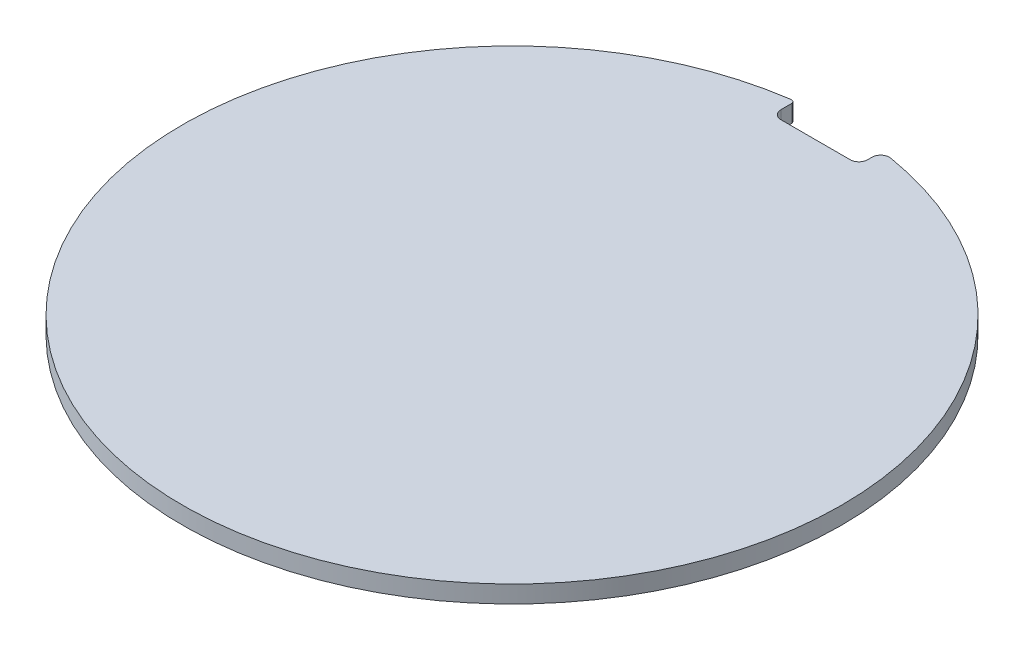
ISO-10303-21;
HEADER;
FILE_DESCRIPTION(('STEP AP214'),'2;1');
FILE_NAME('part.step','',(''),(''),'','','');
FILE_SCHEMA(('AUTOMOTIVE_DESIGN { 1 0 10303 214 1 1 1 1 }'));
ENDSEC;
DATA;
#1=APPLICATION_CONTEXT('core data for automotive mechanical design processes');
#2=APPLICATION_PROTOCOL_DEFINITION('international standard','automotive_design',2000,#1);
#3=PRODUCT_CONTEXT('',#1,'mechanical');
#4=PRODUCT('Part','Part','',(#3));
#5=PRODUCT_RELATED_PRODUCT_CATEGORY('part','',(#4));
#6=PRODUCT_DEFINITION_FORMATION('','',#4);
#7=PRODUCT_DEFINITION_CONTEXT('part definition',#1,'design');
#8=PRODUCT_DEFINITION('design','',#6,#7);
#9=PRODUCT_DEFINITION_SHAPE('','',#8);
#10=(LENGTH_UNIT() NAMED_UNIT(*) SI_UNIT(.MILLI.,.METRE.));
#11=(NAMED_UNIT(*) PLANE_ANGLE_UNIT() SI_UNIT($,.RADIAN.));
#12=(NAMED_UNIT(*) SI_UNIT($,.STERADIAN.) SOLID_ANGLE_UNIT());
#13=UNCERTAINTY_MEASURE_WITH_UNIT(LENGTH_MEASURE(1.E-05),#10,'distance_accuracy_value','');
#14=(GEOMETRIC_REPRESENTATION_CONTEXT(3) GLOBAL_UNCERTAINTY_ASSIGNED_CONTEXT((#13)) GLOBAL_UNIT_ASSIGNED_CONTEXT((#10,
#11,#12)) REPRESENTATION_CONTEXT('',''));
#15=CARTESIAN_POINT('',(0.,0.,0.));
#16=DIRECTION('',(0.,0.,1.));
#17=DIRECTION('',(1.,0.,0.));
#18=AXIS2_PLACEMENT_3D('',#15,#16,#17);
#19=CARTESIAN_POINT('',(-2.70000000000048,1.,-18.6051068258148));
#20=DIRECTION('',(0.,-1.,0.));
#21=DIRECTION('',(0.,0.,-1.));
#22=AXIS2_PLACEMENT_3D('',#19,#20,#21);
#23=CYLINDRICAL_SURFACE('',#22,0.200000000000484);
#24=CARTESIAN_POINT('',(-2.70000000000048,0.,-18.6051068258148));
#25=DIRECTION('',(0.,1.,0.));
#26=DIRECTION('',(0.,0.,1.));
#27=AXIS2_PLACEMENT_3D('',#24,#25,#26);
#28=CIRCLE('',#27,0.200000000000484);
#29=CARTESIAN_POINT('',(-2.5,0.,-18.605106825815));
#30=VERTEX_POINT('',#29);
#31=CARTESIAN_POINT('',(-2.72872340425587,0.,-18.803033494175));
#32=VERTEX_POINT('',#31);
#33=EDGE_CURVE('E143',#30,#32,#28,.T.);
#34=ORIENTED_EDGE('',*,*,#33,.T.);
#35=DIRECTION('',(0.,-1.,0.));
#36=VECTOR('',#35,1.);
#37=CARTESIAN_POINT('',(-2.72872340425587,1.,-18.803033494175));
#38=LINE('',#37,#36);
#39=CARTESIAN_POINT('',(-2.72872340425587,1.,-18.803033494175));
#40=VERTEX_POINT('',#39);
#41=EDGE_CURVE('E11',#40,#32,#38,.T.);
#42=ORIENTED_EDGE('',*,*,#41,.F.);
#43=CARTESIAN_POINT('',(-2.70000000000048,1.,-18.6051068258148));
#44=DIRECTION('',(0.,1.,0.));
#45=DIRECTION('',(0.,0.,1.));
#46=AXIS2_PLACEMENT_3D('',#43,#44,#45);
#47=CIRCLE('',#46,0.200000000000484);
#48=CARTESIAN_POINT('',(-2.5,1.,-18.605106825815));
#49=VERTEX_POINT('',#48);
#50=EDGE_CURVE('E157',#49,#40,#47,.T.);
#51=ORIENTED_EDGE('',*,*,#50,.F.);
#52=DIRECTION('',(0.,-1.,0.));
#53=VECTOR('',#52,1.);
#54=CARTESIAN_POINT('',(-2.5,1.,-18.605106825815));
#55=LINE('',#54,#53);
#56=EDGE_CURVE('E139',#49,#30,#55,.T.);
#57=ORIENTED_EDGE('',*,*,#56,.T.);
#58=EDGE_LOOP('',(#34,#42,#51,#57));
#59=FACE_BOUND('',#58,.T.);
#60=ADVANCED_FACE('F47',(#59),#23,.T.);
#61=CARTESIAN_POINT('',(-4.80301562411078E-13,1.,0.));
#62=DIRECTION('',(0.,-1.,0.));
#63=DIRECTION('',(0.,0.,-1.));
#64=AXIS2_PLACEMENT_3D('',#61,#62,#63);
#65=CYLINDRICAL_SURFACE('',#64,18.9999999999999);
#66=CARTESIAN_POINT('',(-4.80301562411078E-13,0.,0.));
#67=DIRECTION('',(0.,1.,0.));
#68=DIRECTION('',(0.,0.,1.));
#69=AXIS2_PLACEMENT_3D('',#66,#67,#68);
#70=CIRCLE('',#69,18.9999999999999);
#71=CARTESIAN_POINT('',(3.08108108108021,0.,-18.7485183247051));
#72=VERTEX_POINT('',#71);
#73=EDGE_CURVE('E146',#32,#72,#70,.T.);
#74=ORIENTED_EDGE('',*,*,#73,.T.);
#75=DIRECTION('',(0.,-1.,0.));
#76=VECTOR('',#75,1.);
#77=CARTESIAN_POINT('',(3.08108108108021,1.,-18.7485183247051));
#78=LINE('',#77,#76);
#79=CARTESIAN_POINT('',(3.08108108108021,1.,-18.7485183247051));
#80=VERTEX_POINT('',#79);
#81=EDGE_CURVE('E55',#80,#72,#78,.T.);
#82=ORIENTED_EDGE('',*,*,#81,.F.);
#83=CARTESIAN_POINT('',(-4.80301562411078E-13,1.,0.));
#84=DIRECTION('',(0.,1.,0.));
#85=DIRECTION('',(0.,0.,1.));
#86=AXIS2_PLACEMENT_3D('',#83,#84,#85);
#87=CIRCLE('',#86,18.9999999999999);
#88=EDGE_CURVE('E106',#40,#80,#87,.T.);
#89=ORIENTED_EDGE('',*,*,#88,.F.);
#90=ORIENTED_EDGE('',*,*,#41,.T.);
#91=EDGE_LOOP('',(#74,#82,#89,#90));
#92=FACE_BOUND('',#91,.T.);
#93=ADVANCED_FACE('F192',(#92),#65,.T.);
#94=CARTESIAN_POINT('',(2.99999999999926,1.,-18.2551362635294));
#95=DIRECTION('',(0.,-1.,0.));
#96=DIRECTION('',(0.,0.,-1.));
#97=AXIS2_PLACEMENT_3D('',#94,#95,#96);
#98=CYLINDRICAL_SURFACE('',#97,0.499999999999264);
#99=CARTESIAN_POINT('',(2.99999999999926,0.,-18.2551362635294));
#100=DIRECTION('',(0.,1.,0.));
#101=DIRECTION('',(0.,0.,1.));
#102=AXIS2_PLACEMENT_3D('',#99,#100,#101);
#103=CIRCLE('',#102,0.499999999999264);
#104=CARTESIAN_POINT('',(2.5,0.,-18.255136263529));
#105=VERTEX_POINT('',#104);
#106=EDGE_CURVE('E148',#72,#105,#103,.T.);
#107=ORIENTED_EDGE('',*,*,#106,.T.);
#108=DIRECTION('',(0.,-1.,0.));
#109=VECTOR('',#108,1.);
#110=CARTESIAN_POINT('',(2.5,1.,-18.255136263529));
#111=LINE('',#110,#109);
#112=CARTESIAN_POINT('',(2.5,1.,-18.255136263529));
#113=VERTEX_POINT('',#112);
#114=EDGE_CURVE('E164',#113,#105,#111,.T.);
#115=ORIENTED_EDGE('',*,*,#114,.F.);
#116=CARTESIAN_POINT('',(2.99999999999926,1.,-18.2551362635294));
#117=DIRECTION('',(0.,1.,0.));
#118=DIRECTION('',(0.,0.,1.));
#119=AXIS2_PLACEMENT_3D('',#116,#117,#118);
#120=CIRCLE('',#119,0.499999999999264);
#121=EDGE_CURVE('E172',#80,#113,#120,.T.);
#122=ORIENTED_EDGE('',*,*,#121,.F.);
#123=ORIENTED_EDGE('',*,*,#81,.T.);
#124=EDGE_LOOP('',(#107,#115,#122,#123));
#125=FACE_BOUND('',#124,.T.);
#126=ADVANCED_FACE('F170',(#125),#98,.T.);
#127=CARTESIAN_POINT('',(2.5,1.,-18.255136263529));
#128=DIRECTION('',(1.,0.,0.));
#129=DIRECTION('',(0.,0.,-1.));
#130=AXIS2_PLACEMENT_3D('',#127,#128,#129);
#131=PLANE('',#130);
#132=DIRECTION('',(0.,0.,1.));
#133=VECTOR('',#132,1.);
#134=CARTESIAN_POINT('',(2.5,0.,-18.255136263529));
#135=LINE('',#134,#133);
#136=CARTESIAN_POINT('',(2.5,0.,-18.));
#137=VERTEX_POINT('',#136);
#138=EDGE_CURVE('E150',#105,#137,#135,.T.);
#139=ORIENTED_EDGE('',*,*,#138,.T.);
#140=DIRECTION('',(0.,-1.,0.));
#141=VECTOR('',#140,1.);
#142=CARTESIAN_POINT('',(2.5,1.,-18.));
#143=LINE('',#142,#141);
#144=CARTESIAN_POINT('',(2.5,1.,-18.));
#145=VERTEX_POINT('',#144);
#146=EDGE_CURVE('E161',#145,#137,#143,.T.);
#147=ORIENTED_EDGE('',*,*,#146,.F.);
#148=DIRECTION('',(0.,0.,1.));
#149=VECTOR('',#148,1.);
#150=CARTESIAN_POINT('',(2.5,1.,-18.255136263529));
#151=LINE('',#150,#149);
#152=EDGE_CURVE('E184',#113,#145,#151,.T.);
#153=ORIENTED_EDGE('',*,*,#152,.F.);
#154=ORIENTED_EDGE('',*,*,#114,.T.);
#155=EDGE_LOOP('',(#139,#147,#153,#154));
#156=FACE_BOUND('',#155,.T.);
#157=ADVANCED_FACE('F180',(#156),#131,.F.);
#158=CARTESIAN_POINT('',(1.99999999999958,1.,-18.0000000000004));
#159=DIRECTION('',(0.,-1.,0.));
#160=DIRECTION('',(0.,0.,-1.));
#161=AXIS2_PLACEMENT_3D('',#158,#159,#160);
#162=CYLINDRICAL_SURFACE('',#161,0.50000000000042);
#163=CARTESIAN_POINT('',(1.99999999999958,0.,-18.0000000000004));
#164=DIRECTION('',(0.,-1.,0.));
#165=DIRECTION('',(0.,0.,-1.));
#166=AXIS2_PLACEMENT_3D('',#163,#164,#165);
#167=CIRCLE('',#166,0.50000000000042);
#168=CARTESIAN_POINT('',(2.,0.,-17.5));
#169=VERTEX_POINT('',#168);
#170=EDGE_CURVE('E152',#137,#169,#167,.T.);
#171=ORIENTED_EDGE('',*,*,#170,.T.);
#172=DIRECTION('',(0.,-1.,0.));
#173=VECTOR('',#172,1.);
#174=CARTESIAN_POINT('',(2.,1.,-17.5));
#175=LINE('',#174,#173);
#176=CARTESIAN_POINT('',(2.,1.,-17.5));
#177=VERTEX_POINT('',#176);
#178=EDGE_CURVE('E134',#177,#169,#175,.T.);
#179=ORIENTED_EDGE('',*,*,#178,.F.);
#180=CARTESIAN_POINT('',(1.99999999999958,1.,-18.0000000000004));
#181=DIRECTION('',(0.,-1.,0.));
#182=DIRECTION('',(0.,0.,-1.));
#183=AXIS2_PLACEMENT_3D('',#180,#181,#182);
#184=CIRCLE('',#183,0.50000000000042);
#185=EDGE_CURVE('E125',#145,#177,#184,.T.);
#186=ORIENTED_EDGE('',*,*,#185,.F.);
#187=ORIENTED_EDGE('',*,*,#146,.T.);
#188=EDGE_LOOP('',(#171,#179,#186,#187));
#189=FACE_BOUND('',#188,.T.);
#190=ADVANCED_FACE('F183',(#189),#162,.F.);
#191=CARTESIAN_POINT('',(2.,1.,-17.5));
#192=DIRECTION('',(0.,0.,1.));
#193=DIRECTION('',(1.,0.,0.));
#194=AXIS2_PLACEMENT_3D('',#191,#192,#193);
#195=PLANE('',#194);
#196=DIRECTION('',(-1.,0.,0.));
#197=VECTOR('',#196,1.);
#198=CARTESIAN_POINT('',(2.,0.,-17.5));
#199=LINE('',#198,#197);
#200=CARTESIAN_POINT('',(-2.,0.,-17.5));
#201=VERTEX_POINT('',#200);
#202=EDGE_CURVE('E133',#169,#201,#199,.T.);
#203=ORIENTED_EDGE('',*,*,#202,.T.);
#204=DIRECTION('',(0.,-1.,0.));
#205=VECTOR('',#204,1.);
#206=CARTESIAN_POINT('',(-2.,1.,-17.5));
#207=LINE('',#206,#205);
#208=CARTESIAN_POINT('',(-2.,1.,-17.5));
#209=VERTEX_POINT('',#208);
#210=EDGE_CURVE('E130',#209,#201,#207,.T.);
#211=ORIENTED_EDGE('',*,*,#210,.F.);
#212=DIRECTION('',(-1.,0.,0.));
#213=VECTOR('',#212,1.);
#214=CARTESIAN_POINT('',(2.,1.,-17.5));
#215=LINE('',#214,#213);
#216=EDGE_CURVE('E119',#177,#209,#215,.T.);
#217=ORIENTED_EDGE('',*,*,#216,.F.);
#218=ORIENTED_EDGE('',*,*,#178,.T.);
#219=EDGE_LOOP('',(#203,#211,#217,#218));
#220=FACE_BOUND('',#219,.T.);
#221=ADVANCED_FACE('F131',(#220),#195,.F.);
#222=CARTESIAN_POINT('',(-1.99999999999958,1.,-18.0000000000004));
#223=DIRECTION('',(0.,-1.,0.));
#224=DIRECTION('',(0.,0.,-1.));
#225=AXIS2_PLACEMENT_3D('',#222,#223,#224);
#226=CYLINDRICAL_SURFACE('',#225,0.50000000000042);
#227=CARTESIAN_POINT('',(-1.99999999999958,0.,-18.0000000000004));
#228=DIRECTION('',(0.,-1.,0.));
#229=DIRECTION('',(0.,0.,-1.));
#230=AXIS2_PLACEMENT_3D('',#227,#228,#229);
#231=CIRCLE('',#230,0.50000000000042);
#232=CARTESIAN_POINT('',(-2.5,0.,-18.));
#233=VERTEX_POINT('',#232);
#234=EDGE_CURVE('E92',#201,#233,#231,.T.);
#235=ORIENTED_EDGE('',*,*,#234,.T.);
#236=DIRECTION('',(0.,-1.,0.));
#237=VECTOR('',#236,1.);
#238=CARTESIAN_POINT('',(-2.5,1.,-18.));
#239=LINE('',#238,#237);
#240=CARTESIAN_POINT('',(-2.5,1.,-18.));
#241=VERTEX_POINT('',#240);
#242=EDGE_CURVE('E135',#241,#233,#239,.T.);
#243=ORIENTED_EDGE('',*,*,#242,.F.);
#244=CARTESIAN_POINT('',(-1.99999999999958,1.,-18.0000000000004));
#245=DIRECTION('',(0.,-1.,0.));
#246=DIRECTION('',(0.,0.,-1.));
#247=AXIS2_PLACEMENT_3D('',#244,#245,#246);
#248=CIRCLE('',#247,0.50000000000042);
#249=EDGE_CURVE('E123',#209,#241,#248,.T.);
#250=ORIENTED_EDGE('',*,*,#249,.F.);
#251=ORIENTED_EDGE('',*,*,#210,.T.);
#252=EDGE_LOOP('',(#235,#243,#250,#251));
#253=FACE_BOUND('',#252,.T.);
#254=ADVANCED_FACE('F137',(#253),#226,.F.);
#255=CARTESIAN_POINT('',(-2.5,1.,-18.));
#256=DIRECTION('',(-1.,0.,0.));
#257=DIRECTION('',(0.,0.,1.));
#258=AXIS2_PLACEMENT_3D('',#255,#256,#257);
#259=PLANE('',#258);
#260=DIRECTION('',(0.,0.,-1.));
#261=VECTOR('',#260,1.);
#262=CARTESIAN_POINT('',(-2.5,0.,-18.));
#263=LINE('',#262,#261);
#264=EDGE_CURVE('E98',#233,#30,#263,.T.);
#265=ORIENTED_EDGE('',*,*,#264,.T.);
#266=ORIENTED_EDGE('',*,*,#56,.F.);
#267=DIRECTION('',(0.,0.,-1.));
#268=VECTOR('',#267,1.);
#269=CARTESIAN_POINT('',(-2.5,1.,-18.));
#270=LINE('',#269,#268);
#271=EDGE_CURVE('E63',#241,#49,#270,.T.);
#272=ORIENTED_EDGE('',*,*,#271,.F.);
#273=ORIENTED_EDGE('',*,*,#242,.T.);
#274=EDGE_LOOP('',(#265,#266,#272,#273));
#275=FACE_BOUND('',#274,.T.);
#276=ADVANCED_FACE('F208',(#275),#259,.F.);
#277=CARTESIAN_POINT('',(-2.70000000000048,1.,-18.6051068258148));
#278=DIRECTION('',(0.,1.,0.));
#279=DIRECTION('',(0.,0.,1.));
#280=AXIS2_PLACEMENT_3D('',#277,#278,#279);
#281=PLANE('',#280);
#282=ORIENTED_EDGE('',*,*,#50,.T.);
#283=ORIENTED_EDGE('',*,*,#88,.T.);
#284=ORIENTED_EDGE('',*,*,#121,.T.);
#285=ORIENTED_EDGE('',*,*,#152,.T.);
#286=ORIENTED_EDGE('',*,*,#185,.T.);
#287=ORIENTED_EDGE('',*,*,#216,.T.);
#288=ORIENTED_EDGE('',*,*,#249,.T.);
#289=ORIENTED_EDGE('',*,*,#271,.T.);
#290=EDGE_LOOP('',(#282,#283,#284,#285,#286,#287,#288,#289));
#291=FACE_BOUND('',#290,.T.);
#292=ADVANCED_FACE('F121',(#291),#281,.T.);
#293=CARTESIAN_POINT('',(-2.70000000000048,0.,-18.6051068258148));
#294=DIRECTION('',(0.,1.,0.));
#295=DIRECTION('',(0.,0.,1.));
#296=AXIS2_PLACEMENT_3D('',#293,#294,#295);
#297=PLANE('',#296);
#298=ORIENTED_EDGE('',*,*,#33,.F.);
#299=ORIENTED_EDGE('',*,*,#264,.F.);
#300=ORIENTED_EDGE('',*,*,#234,.F.);
#301=ORIENTED_EDGE('',*,*,#202,.F.);
#302=ORIENTED_EDGE('',*,*,#170,.F.);
#303=ORIENTED_EDGE('',*,*,#138,.F.);
#304=ORIENTED_EDGE('',*,*,#106,.F.);
#305=ORIENTED_EDGE('',*,*,#73,.F.);
#306=EDGE_LOOP('',(#298,#299,#300,#301,#302,#303,#304,#305));
#307=FACE_BOUND('',#306,.T.);
#308=ADVANCED_FACE('F176',(#307),#297,.F.);
#309=CLOSED_SHELL('',(#60,#93,#126,#157,#190,#221,#254,#276,#292,#308));
#310=MANIFOLD_SOLID_BREP('B2',#309);
#311=ADVANCED_BREP_SHAPE_REPRESENTATION('',(#18,#310),#14);
#312=SHAPE_DEFINITION_REPRESENTATION(#9,#311);
ENDSEC;
END-ISO-10303-21;
